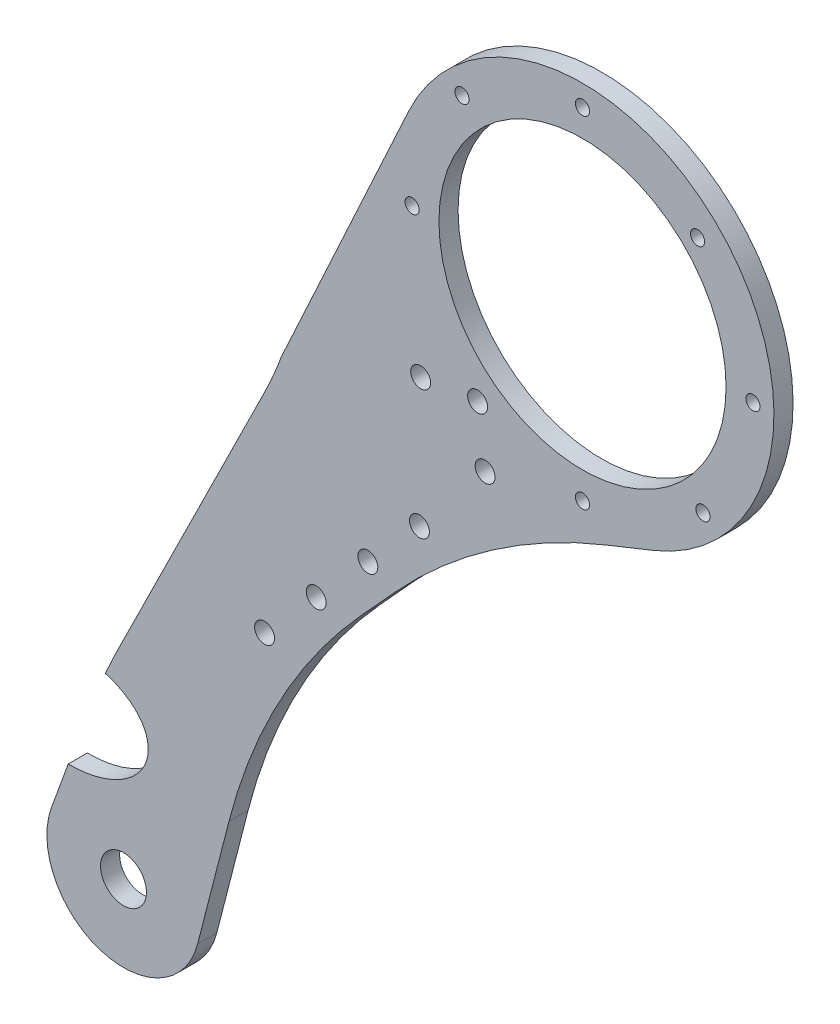
ISO-10303-21;
HEADER;
FILE_DESCRIPTION(('STEP AP214'),'2;1');
FILE_NAME('part.step','',(''),(''),'','','');
FILE_SCHEMA(('AUTOMOTIVE_DESIGN { 1 0 10303 214 1 1 1 1 }'));
ENDSEC;
DATA;
#1=APPLICATION_CONTEXT('core data for automotive mechanical design processes');
#2=APPLICATION_PROTOCOL_DEFINITION('international standard','automotive_design',2000,#1);
#3=PRODUCT_CONTEXT('',#1,'mechanical');
#4=PRODUCT('Part','Part','',(#3));
#5=PRODUCT_RELATED_PRODUCT_CATEGORY('part','',(#4));
#6=PRODUCT_DEFINITION_FORMATION('','',#4);
#7=PRODUCT_DEFINITION_CONTEXT('part definition',#1,'design');
#8=PRODUCT_DEFINITION('design','',#6,#7);
#9=PRODUCT_DEFINITION_SHAPE('','',#8);
#10=(LENGTH_UNIT() NAMED_UNIT(*) SI_UNIT(.MILLI.,.METRE.));
#11=(NAMED_UNIT(*) PLANE_ANGLE_UNIT() SI_UNIT($,.RADIAN.));
#12=(NAMED_UNIT(*) SI_UNIT($,.STERADIAN.) SOLID_ANGLE_UNIT());
#13=UNCERTAINTY_MEASURE_WITH_UNIT(LENGTH_MEASURE(1.E-05),#10,'distance_accuracy_value','');
#14=(GEOMETRIC_REPRESENTATION_CONTEXT(3) GLOBAL_UNCERTAINTY_ASSIGNED_CONTEXT((#13)) GLOBAL_UNIT_ASSIGNED_CONTEXT((#10,
#11,#12)) REPRESENTATION_CONTEXT('',''));
#15=CARTESIAN_POINT('',(0.,0.,0.));
#16=DIRECTION('',(0.,0.,1.));
#17=DIRECTION('',(1.,0.,0.));
#18=AXIS2_PLACEMENT_3D('',#15,#16,#17);
#19=CARTESIAN_POINT('',(-92.5685975077157,-82.8702446991092,5.));
#20=DIRECTION('',(0.,0.,1.));
#21=DIRECTION('',(1.,0.,0.));
#22=AXIS2_PLACEMENT_3D('',#19,#20,#21);
#23=PLANE('',#22);
#24=CARTESIAN_POINT('',(13.0554677029552,39.3964383545388,5.));
#25=DIRECTION('',(0.,0.,1.));
#26=DIRECTION('',(1.,0.,0.));
#27=AXIS2_PLACEMENT_3D('',#24,#25,#26);
#28=CIRCLE('',#27,2.6);
#29=CARTESIAN_POINT('',(15.6554677029552,39.3964383545388,5.));
#30=VERTEX_POINT('',#29);
#31=EDGE_CURVE('E163',#30,#30,#28,.T.);
#32=ORIENTED_EDGE('',*,*,#31,.F.);
#33=EDGE_LOOP('',(#32));
#34=FACE_BOUND('',#33,.T.);
#35=CARTESIAN_POINT('',(-2.12692773331795,3.57822311802661,5.));
#36=DIRECTION('',(0.,0.,1.));
#37=DIRECTION('',(1.,0.,0.));
#38=AXIS2_PLACEMENT_3D('',#35,#36,#37);
#39=CIRCLE('',#38,2.6);
#40=CARTESIAN_POINT('',(0.473072266682053,3.57822311802661,5.));
#41=VERTEX_POINT('',#40);
#42=EDGE_CURVE('E170',#41,#41,#39,.T.);
#43=ORIENTED_EDGE('',*,*,#42,.F.);
#44=EDGE_LOOP('',(#43));
#45=FACE_BOUND('',#44,.T.);
#46=CARTESIAN_POINT('',(-29.0960098710009,-25.9627418061412,5.));
#47=DIRECTION('',(0.,0.,1.));
#48=DIRECTION('',(1.,0.,0.));
#49=AXIS2_PLACEMENT_3D('',#46,#47,#48);
#50=CIRCLE('',#49,2.6);
#51=CARTESIAN_POINT('',(-26.4960098710009,-25.9627418061412,5.));
#52=VERTEX_POINT('',#51);
#53=EDGE_CURVE('E174',#52,#52,#50,.T.);
#54=ORIENTED_EDGE('',*,*,#53,.F.);
#55=EDGE_LOOP('',(#54));
#56=FACE_BOUND('',#55,.T.);
#57=CARTESIAN_POINT('',(-15.6114688021594,-11.1922593440573,5.));
#58=DIRECTION('',(0.,0.,1.));
#59=DIRECTION('',(1.,0.,0.));
#60=AXIS2_PLACEMENT_3D('',#57,#58,#59);
#61=CIRCLE('',#60,2.6);
#62=CARTESIAN_POINT('',(-13.0114688021594,-11.1922593440573,5.));
#63=VERTEX_POINT('',#62);
#64=EDGE_CURVE('E177',#63,#63,#61,.T.);
#65=ORIENTED_EDGE('',*,*,#64,.F.);
#66=EDGE_LOOP('',(#65));
#67=FACE_BOUND('',#66,.T.);
#68=CARTESIAN_POINT('',(-42.5805509398424,-40.7332242682251,5.));
#69=DIRECTION('',(0.,0.,1.));
#70=DIRECTION('',(1.,0.,0.));
#71=AXIS2_PLACEMENT_3D('',#68,#69,#70);
#72=CIRCLE('',#71,2.6);
#73=CARTESIAN_POINT('',(-39.9805509398424,-40.7332242682251,5.));
#74=VERTEX_POINT('',#73);
#75=EDGE_CURVE('E180',#74,#74,#72,.T.);
#76=ORIENTED_EDGE('',*,*,#75,.F.);
#77=EDGE_LOOP('',(#76));
#78=FACE_BOUND('',#77,.T.);
#79=CARTESIAN_POINT('',(40.4497320083475,75.0973386676444,5.));
#80=DIRECTION('',(0.,0.,1.));
#81=DIRECTION('',(1.,0.,0.));
#82=AXIS2_PLACEMENT_3D('',#79,#80,#81);
#83=CIRCLE('',#82,37.5);
#84=CARTESIAN_POINT('',(77.9497320083475,75.0973386676444,5.));
#85=VERTEX_POINT('',#84);
#86=EDGE_CURVE('E183',#85,#85,#83,.T.);
#87=ORIENTED_EDGE('',*,*,#86,.F.);
#88=EDGE_LOOP('',(#87));
#89=FACE_BOUND('',#88,.T.);
#90=CARTESIAN_POINT('',(70.5017702087758,105.149376868073,5.));
#91=DIRECTION('',(0.,0.,1.));
#92=DIRECTION('',(1.,0.,0.));
#93=AXIS2_PLACEMENT_3D('',#90,#91,#92);
#94=CIRCLE('',#93,1.85000000000002);
#95=CARTESIAN_POINT('',(72.3517702087758,105.149376868073,5.));
#96=VERTEX_POINT('',#95);
#97=EDGE_CURVE('E192',#96,#96,#94,.T.);
#98=ORIENTED_EDGE('',*,*,#97,.F.);
#99=EDGE_LOOP('',(#98));
#100=FACE_BOUND('',#99,.T.);
#101=CARTESIAN_POINT('',(-1.81620521765199,37.438545471238,5.));
#102=DIRECTION('',(0.,0.,1.));
#103=DIRECTION('',(1.,0.,0.));
#104=AXIS2_PLACEMENT_3D('',#101,#102,#103);
#105=CIRCLE('',#104,2.6);
#106=CARTESIAN_POINT('',(0.783794782348011,37.438545471238,5.));
#107=VERTEX_POINT('',#106);
#108=EDGE_CURVE('E200',#107,#107,#105,.T.);
#109=ORIENTED_EDGE('',*,*,#108,.F.);
#110=EDGE_LOOP('',(#109));
#111=FACE_BOUND('',#110,.T.);
#112=CARTESIAN_POINT('',(15.013360586256,24.5247654339316,5.));
#113=DIRECTION('',(0.,0.,1.));
#114=DIRECTION('',(1.,0.,0.));
#115=AXIS2_PLACEMENT_3D('',#112,#113,#114);
#116=CIRCLE('',#115,2.6);
#117=CARTESIAN_POINT('',(17.613360586256,24.5247654339316,5.));
#118=VERTEX_POINT('',#117);
#119=EDGE_CURVE('E206',#118,#118,#116,.T.);
#120=ORIENTED_EDGE('',*,*,#119,.F.);
#121=EDGE_LOOP('',(#120));
#122=FACE_BOUND('',#121,.T.);
#123=CARTESIAN_POINT('',(40.4497320083475,119.597338667644,5.));
#124=DIRECTION('',(0.,0.,1.));
#125=DIRECTION('',(1.,0.,0.));
#126=AXIS2_PLACEMENT_3D('',#123,#124,#125);
#127=CIRCLE('',#126,1.85);
#128=CARTESIAN_POINT('',(42.2997320083475,119.597338667644,5.));
#129=VERTEX_POINT('',#128);
#130=EDGE_CURVE('E209',#129,#129,#127,.T.);
#131=ORIENTED_EDGE('',*,*,#130,.F.);
#132=EDGE_LOOP('',(#131));
#133=FACE_BOUND('',#132,.T.);
#134=CARTESIAN_POINT('',(40.4497320083475,30.5973386676444,5.));
#135=DIRECTION('',(0.,0.,1.));
#136=DIRECTION('',(1.,0.,0.));
#137=AXIS2_PLACEMENT_3D('',#134,#135,#136);
#138=CIRCLE('',#137,1.85);
#139=CARTESIAN_POINT('',(42.2997320083475,30.5973386676444,5.));
#140=VERTEX_POINT('',#139);
#141=EDGE_CURVE('E221',#140,#140,#138,.T.);
#142=ORIENTED_EDGE('',*,*,#141,.F.);
#143=EDGE_LOOP('',(#142));
#144=FACE_BOUND('',#143,.T.);
#145=CARTESIAN_POINT('',(71.9159837711489,43.6310869048431,5.));
#146=DIRECTION('',(0.,0.,1.));
#147=DIRECTION('',(1.,0.,0.));
#148=AXIS2_PLACEMENT_3D('',#145,#146,#147);
#149=CIRCLE('',#148,1.84999999999999);
#150=CARTESIAN_POINT('',(73.7659837711489,43.6310869048431,5.));
#151=VERTEX_POINT('',#150);
#152=EDGE_CURVE('E233',#151,#151,#149,.T.);
#153=ORIENTED_EDGE('',*,*,#152,.F.);
#154=EDGE_LOOP('',(#153));
#155=FACE_BOUND('',#154,.T.);
#156=CARTESIAN_POINT('',(84.9497320083475,75.0973386676444,5.));
#157=DIRECTION('',(0.,0.,1.));
#158=DIRECTION('',(1.,0.,0.));
#159=AXIS2_PLACEMENT_3D('',#156,#157,#158);
#160=CIRCLE('',#159,1.85);
#161=CARTESIAN_POINT('',(86.7997320083475,75.0973386676444,5.));
#162=VERTEX_POINT('',#161);
#163=EDGE_CURVE('E245',#162,#162,#160,.T.);
#164=ORIENTED_EDGE('',*,*,#163,.F.);
#165=EDGE_LOOP('',(#164));
#166=FACE_BOUND('',#165,.T.);
#167=CARTESIAN_POINT('',(-4.05026799165248,75.0973386676444,5.));
#168=DIRECTION('',(0.,0.,1.));
#169=DIRECTION('',(1.,0.,0.));
#170=AXIS2_PLACEMENT_3D('',#167,#168,#169);
#171=CIRCLE('',#170,1.85);
#172=CARTESIAN_POINT('',(-2.20026799165248,75.0973386676444,5.));
#173=VERTEX_POINT('',#172);
#174=EDGE_CURVE('E239',#173,#173,#171,.T.);
#175=ORIENTED_EDGE('',*,*,#174,.F.);
#176=EDGE_LOOP('',(#175));
#177=FACE_BOUND('',#176,.T.);
#178=CARTESIAN_POINT('',(-79.4291349249004,-114.893219250955,5.));
#179=DIRECTION('',(0.,0.,1.));
#180=DIRECTION('',(1.,0.,0.));
#181=AXIS2_PLACEMENT_3D('',#178,#179,#180);
#182=CIRCLE('',#181,6.00000000000002);
#183=CARTESIAN_POINT('',(-73.4291349249004,-114.893219250955,5.));
#184=VERTEX_POINT('',#183);
#185=EDGE_CURVE('E227',#184,#184,#182,.T.);
#186=ORIENTED_EDGE('',*,*,#185,.F.);
#187=EDGE_LOOP('',(#186));
#188=FACE_BOUND('',#187,.T.);
#189=CARTESIAN_POINT('',(8.98348024554615,106.563590430446,5.));
#190=DIRECTION('',(0.,0.,1.));
#191=DIRECTION('',(1.,0.,0.));
#192=AXIS2_PLACEMENT_3D('',#189,#190,#191);
#193=CIRCLE('',#192,1.85);
#194=CARTESIAN_POINT('',(10.8334802455462,106.563590430446,5.));
#195=VERTEX_POINT('',#194);
#196=EDGE_CURVE('E215',#195,#195,#193,.T.);
#197=ORIENTED_EDGE('',*,*,#196,.F.);
#198=EDGE_LOOP('',(#197));
#199=FACE_BOUND('',#198,.T.);
#200=CARTESIAN_POINT('',(-79.4291349249004,-114.893219250955,5.));
#201=DIRECTION('',(0.,0.,1.));
#202=DIRECTION('',(1.,0.,0.));
#203=AXIS2_PLACEMENT_3D('',#200,#201,#202);
#204=CIRCLE('',#203,20.0000000000002);
#205=CARTESIAN_POINT('',(-98.2229873406187,-108.052816384441,5.));
#206=VERTEX_POINT('',#205);
#207=CARTESIAN_POINT('',(-60.0584967359329,-119.871007530112,5.));
#208=VERTEX_POINT('',#207);
#209=EDGE_CURVE('E338',#206,#208,#204,.T.);
#210=ORIENTED_EDGE('',*,*,#209,.T.);
#211=DIRECTION('',(-0.248889413957879,-0.968531909448369,0.));
#212=VECTOR('',#211,1.);
#213=CARTESIAN_POINT('',(-27.4423305383315,7.05201914226437,5.));
#214=LINE('',#213,#212);
#215=CARTESIAN_POINT('',(-51.8827092000331,-88.055628211773,5.));
#216=VERTEX_POINT('',#215);
#217=EDGE_CURVE('E160',#216,#208,#214,.T.);
#218=ORIENTED_EDGE('',*,*,#217,.F.);
#219=CARTESIAN_POINT('',(93.3970772172222,-125.389040305455,5.));
#220=DIRECTION('',(0.,0.,1.));
#221=DIRECTION('',(1.,0.,0.));
#222=AXIS2_PLACEMENT_3D('',#219,#220,#221);
#223=CIRCLE('',#222,150.);
#224=CARTESIAN_POINT('',(-17.381541248407,-24.2549822891438,5.));
#225=VERTEX_POINT('',#224);
#226=EDGE_CURVE('E395',#216,#225,#223,.F.);
#227=ORIENTED_EDGE('',*,*,#226,.T.);
#228=DIRECTION('',(0.674227053442073,0.738524123104195,0.));
#229=VECTOR('',#228,1.);
#230=CARTESIAN_POINT('',(2.59715133783699,-2.37103926476065,5.));
#231=LINE('',#230,#229);
#232=CARTESIAN_POINT('',(-8.39694682767989,-14.4135799275218,5.));
#233=VERTEX_POINT('',#232);
#234=EDGE_CURVE('E144',#225,#233,#231,.T.);
#235=ORIENTED_EDGE('',*,*,#234,.T.);
#236=CARTESIAN_POINT('',(102.381671637949,-115.547637943833,5.));
#237=DIRECTION('',(0.,0.,1.));
#238=DIRECTION('',(1.,0.,0.));
#239=AXIS2_PLACEMENT_3D('',#236,#237,#238);
#240=CIRCLE('',#239,150.);
#241=CARTESIAN_POINT('',(46.5652207080824,23.680677443497,5.));
#242=VERTEX_POINT('',#241);
#243=EDGE_CURVE('E55',#233,#242,#240,.F.);
#244=ORIENTED_EDGE('',*,*,#243,.T.);
#245=DIRECTION('',(0.928188769248865,0.372109672865779,0.));
#246=VECTOR('',#245,1.);
#247=CARTESIAN_POINT('',(-1.73134065067284,4.31864868043409,5.));
#248=LINE('',#247,#246);
#249=CARTESIAN_POINT('',(59.0552156516365,28.6879002052012,5.));
#250=VERTEX_POINT('',#249);
#251=EDGE_CURVE('E138',#242,#250,#248,.T.);
#252=ORIENTED_EDGE('',*,*,#251,.T.);
#253=CARTESIAN_POINT('',(40.4497320083475,75.0973386676444,5.));
#254=DIRECTION('',(0.,0.,1.));
#255=DIRECTION('',(1.,0.,0.));
#256=AXIS2_PLACEMENT_3D('',#253,#254,#255);
#257=CIRCLE('',#256,50.);
#258=CARTESIAN_POINT('',(-4.96294837660688,96.0183439076892,5.));
#259=VERTEX_POINT('',#258);
#260=EDGE_CURVE('E142',#250,#259,#257,.T.);
#261=ORIENTED_EDGE('',*,*,#260,.T.);
#262=DIRECTION('',(0.418420104800895,0.908253607699088,0.));
#263=VECTOR('',#262,1.);
#264=CARTESIAN_POINT('',(-40.5840602403773,18.6965255024349,5.));
#265=LINE('',#264,#263);
#266=CARTESIAN_POINT('',(-38.1758639015197,23.9239344813986,5.));
#267=VERTEX_POINT('',#266);
#268=EDGE_CURVE('E153',#267,#259,#265,.T.);
#269=ORIENTED_EDGE('',*,*,#268,.F.);
#270=CARTESIAN_POINT('',(-132.14512598011,58.125948813966,5.));
#271=DIRECTION('',(0.,0.,-1.));
#272=DIRECTION('',(1.,0.,0.));
#273=AXIS2_PLACEMENT_3D('',#270,#271,#272);
#274=CIRCLE('',#273,100.);
#275=CARTESIAN_POINT('',(-42.5310244349342,13.749008808476,5.));
#276=VERTEX_POINT('',#275);
#277=EDGE_CURVE('E251',#267,#276,#274,.T.);
#278=ORIENTED_EDGE('',*,*,#277,.T.);
#279=DIRECTION('',(-0.4437694000549,-0.896141015451761,0.));
#280=VECTOR('',#279,1.);
#281=CARTESIAN_POINT('',(-42.5310244349342,13.749008808476,5.));
#282=LINE('',#281,#280);
#283=CARTESIAN_POINT('',(-80.4781362784233,-62.8807978809415,5.));
#284=VERTEX_POINT('',#283);
#285=EDGE_CURVE('E253',#276,#284,#282,.T.);
#286=ORIENTED_EDGE('',*,*,#285,.T.);
#287=CARTESIAN_POINT('',(98.750066811929,-151.634677891922,5.));
#288=DIRECTION('',(0.,0.,1.));
#289=DIRECTION('',(1.,0.,0.));
#290=AXIS2_PLACEMENT_3D('',#287,#288,#289);
#291=CIRCLE('',#290,200.);
#292=CARTESIAN_POINT('',(-84.151417051104,-70.7208521221517,5.));
#293=VERTEX_POINT('',#292);
#294=EDGE_CURVE('E256',#284,#293,#291,.T.);
#295=ORIENTED_EDGE('',*,*,#294,.T.);
#296=CARTESIAN_POINT('',(-92.5685975077157,-82.8702446991092,5.));
#297=DIRECTION('',(0.,0.,-1.));
#298=DIRECTION('',(0.998564288915161,0.0535664158158636,0.));
#299=AXIS2_PLACEMENT_3D('',#296,#297,#298);
#300=ELLIPSE('',#299,19.6254544070607,13.1666159932936);
#301=CARTESIAN_POINT('',(-93.8567760538922,-96.0567494655923,5.));
#302=VERTEX_POINT('',#301);
#303=EDGE_CURVE('E258',#293,#302,#300,.T.);
#304=ORIENTED_EDGE('',*,*,#303,.T.);
#305=DIRECTION('',(-0.342020143325669,-0.939692620785908,0.));
#306=VECTOR('',#305,1.);
#307=CARTESIAN_POINT('',(-93.8567760538922,-96.0567494655923,5.));
#308=LINE('',#307,#306);
#309=EDGE_CURVE('E261',#302,#206,#308,.T.);
#310=ORIENTED_EDGE('',*,*,#309,.T.);
#311=EDGE_LOOP('',(#210,#218,#227,#235,#244,#252,#261,#269,#278,#286,#295,#304,#310));
#312=FACE_BOUND('',#311,.T.);
#313=ADVANCED_FACE('F47',(#34,#45,#56,#67,#78,#89,#100,#111,#122,#133,#144,#155,#166,#177,#188,
#199,#312),#23,.T.);
#314=CARTESIAN_POINT('',(-92.5685975077157,-82.8702446991092,0.));
#315=DIRECTION('',(0.,0.,1.));
#316=DIRECTION('',(1.,0.,0.));
#317=AXIS2_PLACEMENT_3D('',#314,#315,#316);
#318=PLANE('',#317);
#319=CARTESIAN_POINT('',(40.4497320083475,119.597338667644,0.));
#320=DIRECTION('',(0.,0.,1.));
#321=DIRECTION('',(1.,0.,0.));
#322=AXIS2_PLACEMENT_3D('',#319,#320,#321);
#323=CIRCLE('',#322,1.85);
#324=CARTESIAN_POINT('',(42.2997320083475,119.597338667644,0.));
#325=VERTEX_POINT('',#324);
#326=EDGE_CURVE('E199',#325,#325,#323,.T.);
#327=ORIENTED_EDGE('',*,*,#326,.T.);
#328=EDGE_LOOP('',(#327));
#329=FACE_BOUND('',#328,.T.);
#330=CARTESIAN_POINT('',(8.98348024554615,106.563590430446,0.));
#331=DIRECTION('',(0.,0.,1.));
#332=DIRECTION('',(1.,0.,0.));
#333=AXIS2_PLACEMENT_3D('',#330,#331,#332);
#334=CIRCLE('',#333,1.85);
#335=CARTESIAN_POINT('',(10.8334802455462,106.563590430446,0.));
#336=VERTEX_POINT('',#335);
#337=EDGE_CURVE('E212',#336,#336,#334,.T.);
#338=ORIENTED_EDGE('',*,*,#337,.T.);
#339=EDGE_LOOP('',(#338));
#340=FACE_BOUND('',#339,.T.);
#341=CARTESIAN_POINT('',(40.4497320083475,30.5973386676444,0.));
#342=DIRECTION('',(0.,0.,1.));
#343=DIRECTION('',(1.,0.,0.));
#344=AXIS2_PLACEMENT_3D('',#341,#342,#343);
#345=CIRCLE('',#344,1.85);
#346=CARTESIAN_POINT('',(42.2997320083475,30.5973386676444,0.));
#347=VERTEX_POINT('',#346);
#348=EDGE_CURVE('E218',#347,#347,#345,.T.);
#349=ORIENTED_EDGE('',*,*,#348,.T.);
#350=EDGE_LOOP('',(#349));
#351=FACE_BOUND('',#350,.T.);
#352=CARTESIAN_POINT('',(-79.4291349249004,-114.893219250955,0.));
#353=DIRECTION('',(0.,0.,1.));
#354=DIRECTION('',(1.,0.,0.));
#355=AXIS2_PLACEMENT_3D('',#352,#353,#354);
#356=CIRCLE('',#355,6.00000000000002);
#357=CARTESIAN_POINT('',(-73.4291349249004,-114.893219250955,0.));
#358=VERTEX_POINT('',#357);
#359=EDGE_CURVE('E224',#358,#358,#356,.T.);
#360=ORIENTED_EDGE('',*,*,#359,.T.);
#361=EDGE_LOOP('',(#360));
#362=FACE_BOUND('',#361,.T.);
#363=CARTESIAN_POINT('',(71.9159837711489,43.6310869048431,0.));
#364=DIRECTION('',(0.,0.,1.));
#365=DIRECTION('',(1.,0.,0.));
#366=AXIS2_PLACEMENT_3D('',#363,#364,#365);
#367=CIRCLE('',#366,1.84999999999999);
#368=CARTESIAN_POINT('',(73.7659837711489,43.6310869048431,0.));
#369=VERTEX_POINT('',#368);
#370=EDGE_CURVE('E230',#369,#369,#367,.T.);
#371=ORIENTED_EDGE('',*,*,#370,.T.);
#372=EDGE_LOOP('',(#371));
#373=FACE_BOUND('',#372,.T.);
#374=CARTESIAN_POINT('',(-4.05026799165248,75.0973386676444,0.));
#375=DIRECTION('',(0.,0.,1.));
#376=DIRECTION('',(1.,0.,0.));
#377=AXIS2_PLACEMENT_3D('',#374,#375,#376);
#378=CIRCLE('',#377,1.85);
#379=CARTESIAN_POINT('',(-2.20026799165248,75.0973386676444,0.));
#380=VERTEX_POINT('',#379);
#381=EDGE_CURVE('E236',#380,#380,#378,.T.);
#382=ORIENTED_EDGE('',*,*,#381,.T.);
#383=EDGE_LOOP('',(#382));
#384=FACE_BOUND('',#383,.T.);
#385=CARTESIAN_POINT('',(84.9497320083475,75.0973386676444,0.));
#386=DIRECTION('',(0.,0.,1.));
#387=DIRECTION('',(1.,0.,0.));
#388=AXIS2_PLACEMENT_3D('',#385,#386,#387);
#389=CIRCLE('',#388,1.85);
#390=CARTESIAN_POINT('',(86.7997320083475,75.0973386676444,0.));
#391=VERTEX_POINT('',#390);
#392=EDGE_CURVE('E242',#391,#391,#389,.T.);
#393=ORIENTED_EDGE('',*,*,#392,.T.);
#394=EDGE_LOOP('',(#393));
#395=FACE_BOUND('',#394,.T.);
#396=CARTESIAN_POINT('',(15.013360586256,24.5247654339316,0.));
#397=DIRECTION('',(0.,0.,1.));
#398=DIRECTION('',(1.,0.,0.));
#399=AXIS2_PLACEMENT_3D('',#396,#397,#398);
#400=CIRCLE('',#399,2.6);
#401=CARTESIAN_POINT('',(17.613360586256,24.5247654339316,0.));
#402=VERTEX_POINT('',#401);
#403=EDGE_CURVE('E203',#402,#402,#400,.T.);
#404=ORIENTED_EDGE('',*,*,#403,.T.);
#405=EDGE_LOOP('',(#404));
#406=FACE_BOUND('',#405,.T.);
#407=CARTESIAN_POINT('',(-1.81620521765199,37.438545471238,0.));
#408=DIRECTION('',(0.,0.,1.));
#409=DIRECTION('',(1.,0.,0.));
#410=AXIS2_PLACEMENT_3D('',#407,#408,#409);
#411=CIRCLE('',#410,2.6);
#412=CARTESIAN_POINT('',(0.783794782348011,37.438545471238,0.));
#413=VERTEX_POINT('',#412);
#414=EDGE_CURVE('E196',#413,#413,#411,.T.);
#415=ORIENTED_EDGE('',*,*,#414,.T.);
#416=EDGE_LOOP('',(#415));
#417=FACE_BOUND('',#416,.T.);
#418=CARTESIAN_POINT('',(70.5017702087758,105.149376868073,0.));
#419=DIRECTION('',(0.,0.,1.));
#420=DIRECTION('',(1.,0.,0.));
#421=AXIS2_PLACEMENT_3D('',#418,#419,#420);
#422=CIRCLE('',#421,1.85000000000002);
#423=CARTESIAN_POINT('',(72.3517702087758,105.149376868073,0.));
#424=VERTEX_POINT('',#423);
#425=EDGE_CURVE('E195',#424,#424,#422,.T.);
#426=ORIENTED_EDGE('',*,*,#425,.T.);
#427=EDGE_LOOP('',(#426));
#428=FACE_BOUND('',#427,.T.);
#429=CARTESIAN_POINT('',(40.4497320083475,75.0973386676444,0.));
#430=DIRECTION('',(0.,0.,1.));
#431=DIRECTION('',(1.,0.,0.));
#432=AXIS2_PLACEMENT_3D('',#429,#430,#431);
#433=CIRCLE('',#432,37.5);
#434=CARTESIAN_POINT('',(77.9497320083475,75.0973386676444,0.));
#435=VERTEX_POINT('',#434);
#436=EDGE_CURVE('E154',#435,#435,#433,.T.);
#437=ORIENTED_EDGE('',*,*,#436,.T.);
#438=EDGE_LOOP('',(#437));
#439=FACE_BOUND('',#438,.T.);
#440=CARTESIAN_POINT('',(-42.5805509398424,-40.7332242682251,0.));
#441=DIRECTION('',(0.,0.,1.));
#442=DIRECTION('',(1.,0.,0.));
#443=AXIS2_PLACEMENT_3D('',#440,#441,#442);
#444=CIRCLE('',#443,2.6);
#445=CARTESIAN_POINT('',(-39.9805509398424,-40.7332242682251,0.));
#446=VERTEX_POINT('',#445);
#447=EDGE_CURVE('E173',#446,#446,#444,.T.);
#448=ORIENTED_EDGE('',*,*,#447,.T.);
#449=EDGE_LOOP('',(#448));
#450=FACE_BOUND('',#449,.T.);
#451=CARTESIAN_POINT('',(-15.6114688021594,-11.1922593440573,0.));
#452=DIRECTION('',(0.,0.,1.));
#453=DIRECTION('',(1.,0.,0.));
#454=AXIS2_PLACEMENT_3D('',#451,#452,#453);
#455=CIRCLE('',#454,2.6);
#456=CARTESIAN_POINT('',(-13.0114688021594,-11.1922593440573,0.));
#457=VERTEX_POINT('',#456);
#458=EDGE_CURVE('E373',#457,#457,#455,.T.);
#459=ORIENTED_EDGE('',*,*,#458,.T.);
#460=EDGE_LOOP('',(#459));
#461=FACE_BOUND('',#460,.T.);
#462=CARTESIAN_POINT('',(-29.0960098710009,-25.9627418061412,0.));
#463=DIRECTION('',(0.,0.,1.));
#464=DIRECTION('',(1.,0.,0.));
#465=AXIS2_PLACEMENT_3D('',#462,#463,#464);
#466=CIRCLE('',#465,2.6);
#467=CARTESIAN_POINT('',(-26.4960098710009,-25.9627418061412,0.));
#468=VERTEX_POINT('',#467);
#469=EDGE_CURVE('E376',#468,#468,#466,.T.);
#470=ORIENTED_EDGE('',*,*,#469,.T.);
#471=EDGE_LOOP('',(#470));
#472=FACE_BOUND('',#471,.T.);
#473=CARTESIAN_POINT('',(-2.12692773331795,3.57822311802661,0.));
#474=DIRECTION('',(0.,0.,1.));
#475=DIRECTION('',(1.,0.,0.));
#476=AXIS2_PLACEMENT_3D('',#473,#474,#475);
#477=CIRCLE('',#476,2.6);
#478=CARTESIAN_POINT('',(0.473072266682053,3.57822311802661,0.));
#479=VERTEX_POINT('',#478);
#480=EDGE_CURVE('E185',#479,#479,#477,.T.);
#481=ORIENTED_EDGE('',*,*,#480,.T.);
#482=EDGE_LOOP('',(#481));
#483=FACE_BOUND('',#482,.T.);
#484=CARTESIAN_POINT('',(13.0554677029552,39.3964383545388,0.));
#485=DIRECTION('',(0.,0.,1.));
#486=DIRECTION('',(1.,0.,0.));
#487=AXIS2_PLACEMENT_3D('',#484,#485,#486);
#488=CIRCLE('',#487,2.6);
#489=CARTESIAN_POINT('',(15.6554677029552,39.3964383545388,0.));
#490=VERTEX_POINT('',#489);
#491=EDGE_CURVE('E169',#490,#490,#488,.T.);
#492=ORIENTED_EDGE('',*,*,#491,.T.);
#493=EDGE_LOOP('',(#492));
#494=FACE_BOUND('',#493,.T.);
#495=DIRECTION('',(0.674227053442073,0.738524123104195,0.));
#496=VECTOR('',#495,1.);
#497=CARTESIAN_POINT('',(-80.7467027896559,-93.6629067022912,0.));
#498=LINE('',#497,#496);
#499=CARTESIAN_POINT('',(-17.3815412484069,-24.2549822891438,0.));
#500=VERTEX_POINT('',#499);
#501=CARTESIAN_POINT('',(-8.39694682767987,-14.4135799275218,0.));
#502=VERTEX_POINT('',#501);
#503=EDGE_CURVE('E384',#500,#502,#498,.T.);
#504=ORIENTED_EDGE('',*,*,#503,.F.);
#505=CARTESIAN_POINT('',(93.3970772172222,-125.389040305455,0.));
#506=DIRECTION('',(0.,0.,1.));
#507=DIRECTION('',(1.,0.,0.));
#508=AXIS2_PLACEMENT_3D('',#505,#506,#507);
#509=CIRCLE('',#508,150.);
#510=CARTESIAN_POINT('',(-51.8827092000331,-88.0556282117729,0.));
#511=VERTEX_POINT('',#510);
#512=EDGE_CURVE('E397',#500,#511,#509,.T.);
#513=ORIENTED_EDGE('',*,*,#512,.T.);
#514=DIRECTION('',(-0.248889413957879,-0.968531909448369,0.));
#515=VECTOR('',#514,1.);
#516=CARTESIAN_POINT('',(-53.1530600584291,-92.9990901412539,0.));
#517=LINE('',#516,#515);
#518=CARTESIAN_POINT('',(-60.0584967359329,-119.871007530112,0.));
#519=VERTEX_POINT('',#518);
#520=EDGE_CURVE('E334',#511,#519,#517,.T.);
#521=ORIENTED_EDGE('',*,*,#520,.T.);
#522=CARTESIAN_POINT('',(-79.4291349249004,-114.893219250955,0.));
#523=DIRECTION('',(0.,0.,1.));
#524=DIRECTION('',(1.,0.,0.));
#525=AXIS2_PLACEMENT_3D('',#522,#523,#524);
#526=CIRCLE('',#525,20.0000000000002);
#527=CARTESIAN_POINT('',(-98.2229873406187,-108.052816384441,0.));
#528=VERTEX_POINT('',#527);
#529=EDGE_CURVE('E254',#528,#519,#526,.T.);
#530=ORIENTED_EDGE('',*,*,#529,.F.);
#531=DIRECTION('',(-0.342020143325669,-0.939692620785908,0.));
#532=VECTOR('',#531,1.);
#533=CARTESIAN_POINT('',(-93.8567760538922,-96.0567494655923,0.));
#534=LINE('',#533,#532);
#535=CARTESIAN_POINT('',(-93.8567760538922,-96.0567494655923,0.));
#536=VERTEX_POINT('',#535);
#537=EDGE_CURVE('E328',#536,#528,#534,.T.);
#538=ORIENTED_EDGE('',*,*,#537,.F.);
#539=CARTESIAN_POINT('',(-92.5685975077157,-82.8702446991092,0.));
#540=DIRECTION('',(0.,0.,-1.));
#541=DIRECTION('',(0.998564288915161,0.0535664158158636,0.));
#542=AXIS2_PLACEMENT_3D('',#539,#540,#541);
#543=ELLIPSE('',#542,19.6254544070607,13.1666159932936);
#544=CARTESIAN_POINT('',(-84.151417051104,-70.7208521221517,0.));
#545=VERTEX_POINT('',#544);
#546=EDGE_CURVE('E348',#545,#536,#543,.T.);
#547=ORIENTED_EDGE('',*,*,#546,.F.);
#548=CARTESIAN_POINT('',(98.750066811929,-151.634677891922,0.));
#549=DIRECTION('',(0.,0.,1.));
#550=DIRECTION('',(1.,0.,0.));
#551=AXIS2_PLACEMENT_3D('',#548,#549,#550);
#552=CIRCLE('',#551,200.);
#553=CARTESIAN_POINT('',(-80.4781362784233,-62.8807978809415,0.));
#554=VERTEX_POINT('',#553);
#555=EDGE_CURVE('E346',#554,#545,#552,.T.);
#556=ORIENTED_EDGE('',*,*,#555,.F.);
#557=DIRECTION('',(-0.4437694000549,-0.896141015451761,0.));
#558=VECTOR('',#557,1.);
#559=CARTESIAN_POINT('',(-42.5310244349342,13.749008808476,0.));
#560=LINE('',#559,#558);
#561=CARTESIAN_POINT('',(-42.5310244349342,13.749008808476,0.));
#562=VERTEX_POINT('',#561);
#563=EDGE_CURVE('E344',#562,#554,#560,.T.);
#564=ORIENTED_EDGE('',*,*,#563,.F.);
#565=CARTESIAN_POINT('',(-132.14512598011,58.125948813966,0.));
#566=DIRECTION('',(0.,0.,-1.));
#567=DIRECTION('',(1.,0.,0.));
#568=AXIS2_PLACEMENT_3D('',#565,#566,#567);
#569=CIRCLE('',#568,100.);
#570=CARTESIAN_POINT('',(-38.1758639015197,23.9239344813986,0.));
#571=VERTEX_POINT('',#570);
#572=EDGE_CURVE('E248',#571,#562,#569,.T.);
#573=ORIENTED_EDGE('',*,*,#572,.F.);
#574=DIRECTION('',(0.418420104800895,0.908253607699088,0.));
#575=VECTOR('',#574,1.);
#576=CARTESIAN_POINT('',(-88.2838521808065,-84.8441686929509,0.));
#577=LINE('',#576,#575);
#578=CARTESIAN_POINT('',(-4.96294837660688,96.0183439076892,0.));
#579=VERTEX_POINT('',#578);
#580=EDGE_CURVE('E189',#571,#579,#577,.T.);
#581=ORIENTED_EDGE('',*,*,#580,.T.);
#582=CARTESIAN_POINT('',(40.4497320083475,75.0973386676444,0.));
#583=DIRECTION('',(0.,0.,1.));
#584=DIRECTION('',(1.,0.,0.));
#585=AXIS2_PLACEMENT_3D('',#582,#583,#584);
#586=CIRCLE('',#585,50.);
#587=CARTESIAN_POINT('',(59.0552156516365,28.6879002052012,0.));
#588=VERTEX_POINT('',#587);
#589=EDGE_CURVE('E365',#588,#579,#586,.T.);
#590=ORIENTED_EDGE('',*,*,#589,.F.);
#591=DIRECTION('',(0.928188769248865,0.372109672865779,0.));
#592=VECTOR('',#591,1.);
#593=CARTESIAN_POINT('',(-110.104760637619,-39.1281147309813,0.));
#594=LINE('',#593,#592);
#595=CARTESIAN_POINT('',(46.5652207080824,23.680677443497,0.));
#596=VERTEX_POINT('',#595);
#597=EDGE_CURVE('E157',#596,#588,#594,.T.);
#598=ORIENTED_EDGE('',*,*,#597,.F.);
#599=CARTESIAN_POINT('',(102.381671637949,-115.547637943833,0.));
#600=DIRECTION('',(0.,0.,1.));
#601=DIRECTION('',(1.,0.,0.));
#602=AXIS2_PLACEMENT_3D('',#599,#600,#601);
#603=CIRCLE('',#602,150.);
#604=EDGE_CURVE('E11',#596,#502,#603,.T.);
#605=ORIENTED_EDGE('',*,*,#604,.T.);
#606=EDGE_LOOP('',(#504,#513,#521,#530,#538,#547,#556,#564,#573,#581,#590,#598,#605));
#607=FACE_BOUND('',#606,.T.);
#608=ADVANCED_FACE('F281',(#329,#340,#351,#362,#373,#384,#395,#406,#417,#428,#439,#450,#461,
#472,#483,#494,#607),#318,.F.);
#609=CARTESIAN_POINT('',(-132.14512598011,58.125948813966,5.));
#610=DIRECTION('',(0.,0.,-1.));
#611=DIRECTION('',(-1.,0.,0.));
#612=AXIS2_PLACEMENT_3D('',#609,#610,#611);
#613=CYLINDRICAL_SURFACE('',#612,100.);
#614=ORIENTED_EDGE('',*,*,#572,.T.);
#615=DIRECTION('',(0.,0.,-1.));
#616=VECTOR('',#615,1.);
#617=CARTESIAN_POINT('',(-42.5310244349342,13.749008808476,5.));
#618=LINE('',#617,#616);
#619=EDGE_CURVE('E359',#276,#562,#618,.T.);
#620=ORIENTED_EDGE('',*,*,#619,.F.);
#621=ORIENTED_EDGE('',*,*,#277,.F.);
#622=DIRECTION('',(0.,0.,-1.));
#623=VECTOR('',#622,1.);
#624=CARTESIAN_POINT('',(-38.1758639015197,23.9239344813986,5.));
#625=LINE('',#624,#623);
#626=EDGE_CURVE('E362',#267,#571,#625,.T.);
#627=ORIENTED_EDGE('',*,*,#626,.T.);
#628=EDGE_LOOP('',(#614,#620,#621,#627));
#629=FACE_BOUND('',#628,.T.);
#630=ADVANCED_FACE('F278',(#629),#613,.F.);
#631=CARTESIAN_POINT('',(-42.5310244349342,13.749008808476,5.));
#632=DIRECTION('',(0.896141015451761,-0.4437694000549,0.));
#633=DIRECTION('',(0.4437694000549,0.896141015451761,0.));
#634=AXIS2_PLACEMENT_3D('',#631,#632,#633);
#635=PLANE('',#634);
#636=ORIENTED_EDGE('',*,*,#563,.T.);
#637=DIRECTION('',(0.,0.,-1.));
#638=VECTOR('',#637,1.);
#639=CARTESIAN_POINT('',(-80.4781362784233,-62.8807978809415,5.));
#640=LINE('',#639,#638);
#641=EDGE_CURVE('E356',#284,#554,#640,.T.);
#642=ORIENTED_EDGE('',*,*,#641,.F.);
#643=ORIENTED_EDGE('',*,*,#285,.F.);
#644=ORIENTED_EDGE('',*,*,#619,.T.);
#645=EDGE_LOOP('',(#636,#642,#643,#644));
#646=FACE_BOUND('',#645,.T.);
#647=ADVANCED_FACE('F274',(#646),#635,.F.);
#648=CARTESIAN_POINT('',(98.750066811929,-151.634677891922,5.));
#649=DIRECTION('',(0.,0.,-1.));
#650=DIRECTION('',(-1.,0.,0.));
#651=AXIS2_PLACEMENT_3D('',#648,#649,#650);
#652=CYLINDRICAL_SURFACE('',#651,200.);
#653=ORIENTED_EDGE('',*,*,#555,.T.);
#654=DIRECTION('',(0.,0.,-1.));
#655=VECTOR('',#654,1.);
#656=CARTESIAN_POINT('',(-84.151417051104,-70.7208521221517,5.));
#657=LINE('',#656,#655);
#658=EDGE_CURVE('E353',#293,#545,#657,.T.);
#659=ORIENTED_EDGE('',*,*,#658,.F.);
#660=ORIENTED_EDGE('',*,*,#294,.F.);
#661=ORIENTED_EDGE('',*,*,#641,.T.);
#662=EDGE_LOOP('',(#653,#659,#660,#661));
#663=FACE_BOUND('',#662,.T.);
#664=ADVANCED_FACE('F269',(#663),#652,.T.);
#665=DIRECTION('',(0.,0.,-1.));
#666=VECTOR('',#665,1.);
#667=SURFACE_OF_LINEAR_EXTRUSION('',#300,#666);
#668=ORIENTED_EDGE('',*,*,#546,.T.);
#669=DIRECTION('',(0.,0.,-1.));
#670=VECTOR('',#669,1.);
#671=CARTESIAN_POINT('',(-93.8567760538922,-96.0567494655923,5.));
#672=LINE('',#671,#670);
#673=EDGE_CURVE('E340',#302,#536,#672,.T.);
#674=ORIENTED_EDGE('',*,*,#673,.F.);
#675=ORIENTED_EDGE('',*,*,#303,.F.);
#676=ORIENTED_EDGE('',*,*,#658,.T.);
#677=EDGE_LOOP('',(#668,#674,#675,#676));
#678=FACE_BOUND('',#677,.T.);
#679=ADVANCED_FACE('F264',(#678),#667,.F.);
#680=CARTESIAN_POINT('',(-93.8567760538922,-96.0567494655923,5.));
#681=DIRECTION('',(0.939692620785908,-0.342020143325669,0.));
#682=DIRECTION('',(0.342020143325669,0.939692620785908,0.));
#683=AXIS2_PLACEMENT_3D('',#680,#681,#682);
#684=PLANE('',#683);
#685=ORIENTED_EDGE('',*,*,#537,.T.);
#686=DIRECTION('',(0.,0.,-1.));
#687=VECTOR('',#686,1.);
#688=CARTESIAN_POINT('',(-98.2229873406187,-108.052816384441,5.));
#689=LINE('',#688,#687);
#690=EDGE_CURVE('E325',#206,#528,#689,.T.);
#691=ORIENTED_EDGE('',*,*,#690,.F.);
#692=ORIENTED_EDGE('',*,*,#309,.F.);
#693=ORIENTED_EDGE('',*,*,#673,.T.);
#694=EDGE_LOOP('',(#685,#691,#692,#693));
#695=FACE_BOUND('',#694,.T.);
#696=ADVANCED_FACE('F268',(#695),#684,.F.);
#697=CARTESIAN_POINT('',(-79.4291349249004,-114.893219250955,5.));
#698=DIRECTION('',(0.,0.,-1.));
#699=DIRECTION('',(-1.,0.,0.));
#700=AXIS2_PLACEMENT_3D('',#697,#698,#699);
#701=CYLINDRICAL_SURFACE('',#700,20.0000000000002);
#702=ORIENTED_EDGE('',*,*,#529,.T.);
#703=DIRECTION('',(0.,0.,1.));
#704=VECTOR('',#703,1.);
#705=CARTESIAN_POINT('',(-60.0584967359329,-119.871007530112,-5.));
#706=LINE('',#705,#704);
#707=EDGE_CURVE('E159',#519,#208,#706,.T.);
#708=ORIENTED_EDGE('',*,*,#707,.T.);
#709=ORIENTED_EDGE('',*,*,#209,.F.);
#710=ORIENTED_EDGE('',*,*,#690,.T.);
#711=EDGE_LOOP('',(#702,#708,#709,#710));
#712=FACE_BOUND('',#711,.T.);
#713=ADVANCED_FACE('F308',(#712),#701,.T.);
#714=CARTESIAN_POINT('',(84.9497320083475,75.0973386676444,5.));
#715=DIRECTION('',(0.,0.,-1.));
#716=DIRECTION('',(-1.,0.,0.));
#717=AXIS2_PLACEMENT_3D('',#714,#715,#716);
#718=CYLINDRICAL_SURFACE('',#717,1.85);
#719=ORIENTED_EDGE('',*,*,#163,.T.);
#720=EDGE_LOOP('',(#719));
#721=FACE_BOUND('',#720,.T.);
#722=ORIENTED_EDGE('',*,*,#392,.F.);
#723=EDGE_LOOP('',(#722));
#724=FACE_BOUND('',#723,.T.);
#725=ADVANCED_FACE('F306',(#721,#724),#718,.F.);
#726=CARTESIAN_POINT('',(-4.05026799165248,75.0973386676444,5.));
#727=DIRECTION('',(0.,0.,-1.));
#728=DIRECTION('',(-1.,0.,0.));
#729=AXIS2_PLACEMENT_3D('',#726,#727,#728);
#730=CYLINDRICAL_SURFACE('',#729,1.85);
#731=ORIENTED_EDGE('',*,*,#174,.T.);
#732=EDGE_LOOP('',(#731));
#733=FACE_BOUND('',#732,.T.);
#734=ORIENTED_EDGE('',*,*,#381,.F.);
#735=EDGE_LOOP('',(#734));
#736=FACE_BOUND('',#735,.T.);
#737=ADVANCED_FACE('F315',(#733,#736),#730,.F.);
#738=CARTESIAN_POINT('',(71.9159837711489,43.6310869048431,5.));
#739=DIRECTION('',(0.,0.,-1.));
#740=DIRECTION('',(-1.,0.,0.));
#741=AXIS2_PLACEMENT_3D('',#738,#739,#740);
#742=CYLINDRICAL_SURFACE('',#741,1.84999999999999);
#743=ORIENTED_EDGE('',*,*,#152,.T.);
#744=EDGE_LOOP('',(#743));
#745=FACE_BOUND('',#744,.T.);
#746=ORIENTED_EDGE('',*,*,#370,.F.);
#747=EDGE_LOOP('',(#746));
#748=FACE_BOUND('',#747,.T.);
#749=ADVANCED_FACE('F458',(#745,#748),#742,.F.);
#750=CARTESIAN_POINT('',(-79.4291349249004,-114.893219250955,5.));
#751=DIRECTION('',(0.,0.,-1.));
#752=DIRECTION('',(-1.,0.,0.));
#753=AXIS2_PLACEMENT_3D('',#750,#751,#752);
#754=CYLINDRICAL_SURFACE('',#753,6.00000000000002);
#755=ORIENTED_EDGE('',*,*,#185,.T.);
#756=EDGE_LOOP('',(#755));
#757=FACE_BOUND('',#756,.T.);
#758=ORIENTED_EDGE('',*,*,#359,.F.);
#759=EDGE_LOOP('',(#758));
#760=FACE_BOUND('',#759,.T.);
#761=ADVANCED_FACE('F454',(#757,#760),#754,.F.);
#762=CARTESIAN_POINT('',(40.4497320083475,30.5973386676444,5.));
#763=DIRECTION('',(0.,0.,-1.));
#764=DIRECTION('',(-1.,0.,0.));
#765=AXIS2_PLACEMENT_3D('',#762,#763,#764);
#766=CYLINDRICAL_SURFACE('',#765,1.85);
#767=ORIENTED_EDGE('',*,*,#141,.T.);
#768=EDGE_LOOP('',(#767));
#769=FACE_BOUND('',#768,.T.);
#770=ORIENTED_EDGE('',*,*,#348,.F.);
#771=EDGE_LOOP('',(#770));
#772=FACE_BOUND('',#771,.T.);
#773=ADVANCED_FACE('F450',(#769,#772),#766,.F.);
#774=CARTESIAN_POINT('',(8.98348024554615,106.563590430446,5.));
#775=DIRECTION('',(0.,0.,-1.));
#776=DIRECTION('',(-1.,0.,0.));
#777=AXIS2_PLACEMENT_3D('',#774,#775,#776);
#778=CYLINDRICAL_SURFACE('',#777,1.85);
#779=ORIENTED_EDGE('',*,*,#196,.T.);
#780=EDGE_LOOP('',(#779));
#781=FACE_BOUND('',#780,.T.);
#782=ORIENTED_EDGE('',*,*,#337,.F.);
#783=EDGE_LOOP('',(#782));
#784=FACE_BOUND('',#783,.T.);
#785=ADVANCED_FACE('F446',(#781,#784),#778,.F.);
#786=CARTESIAN_POINT('',(40.4497320083475,119.597338667644,5.));
#787=DIRECTION('',(0.,0.,-1.));
#788=DIRECTION('',(-1.,0.,0.));
#789=AXIS2_PLACEMENT_3D('',#786,#787,#788);
#790=CYLINDRICAL_SURFACE('',#789,1.85);
#791=ORIENTED_EDGE('',*,*,#130,.T.);
#792=EDGE_LOOP('',(#791));
#793=FACE_BOUND('',#792,.T.);
#794=ORIENTED_EDGE('',*,*,#326,.F.);
#795=EDGE_LOOP('',(#794));
#796=FACE_BOUND('',#795,.T.);
#797=ADVANCED_FACE('F442',(#793,#796),#790,.F.);
#798=CARTESIAN_POINT('',(15.013360586256,24.5247654339316,0.));
#799=DIRECTION('',(0.,0.,1.));
#800=DIRECTION('',(1.,0.,0.));
#801=AXIS2_PLACEMENT_3D('',#798,#799,#800);
#802=CYLINDRICAL_SURFACE('',#801,2.6);
#803=ORIENTED_EDGE('',*,*,#403,.F.);
#804=EDGE_LOOP('',(#803));
#805=FACE_BOUND('',#804,.T.);
#806=ORIENTED_EDGE('',*,*,#119,.T.);
#807=EDGE_LOOP('',(#806));
#808=FACE_BOUND('',#807,.T.);
#809=ADVANCED_FACE('F438',(#805,#808),#802,.F.);
#810=CARTESIAN_POINT('',(-1.81620521765199,37.438545471238,0.));
#811=DIRECTION('',(0.,0.,1.));
#812=DIRECTION('',(1.,0.,0.));
#813=AXIS2_PLACEMENT_3D('',#810,#811,#812);
#814=CYLINDRICAL_SURFACE('',#813,2.6);
#815=ORIENTED_EDGE('',*,*,#414,.F.);
#816=EDGE_LOOP('',(#815));
#817=FACE_BOUND('',#816,.T.);
#818=ORIENTED_EDGE('',*,*,#108,.T.);
#819=EDGE_LOOP('',(#818));
#820=FACE_BOUND('',#819,.T.);
#821=ADVANCED_FACE('F434',(#817,#820),#814,.F.);
#822=CARTESIAN_POINT('',(70.5017702087758,105.149376868073,-5.));
#823=DIRECTION('',(0.,0.,1.));
#824=DIRECTION('',(1.,0.,0.));
#825=AXIS2_PLACEMENT_3D('',#822,#823,#824);
#826=CYLINDRICAL_SURFACE('',#825,1.85000000000002);
#827=ORIENTED_EDGE('',*,*,#97,.T.);
#828=EDGE_LOOP('',(#827));
#829=FACE_BOUND('',#828,.T.);
#830=ORIENTED_EDGE('',*,*,#425,.F.);
#831=EDGE_LOOP('',(#830));
#832=FACE_BOUND('',#831,.T.);
#833=ADVANCED_FACE('F429',(#829,#832),#826,.F.);
#834=CARTESIAN_POINT('',(40.4497320083475,75.0973386676444,-5.));
#835=DIRECTION('',(0.,0.,1.));
#836=DIRECTION('',(1.,0.,0.));
#837=AXIS2_PLACEMENT_3D('',#834,#835,#836);
#838=CYLINDRICAL_SURFACE('',#837,50.);
#839=ORIENTED_EDGE('',*,*,#589,.T.);
#840=DIRECTION('',(0.,0.,1.));
#841=VECTOR('',#840,1.);
#842=CARTESIAN_POINT('',(-4.96294837660688,96.0183439076892,-5.));
#843=LINE('',#842,#841);
#844=EDGE_CURVE('E151',#579,#259,#843,.T.);
#845=ORIENTED_EDGE('',*,*,#844,.T.);
#846=ORIENTED_EDGE('',*,*,#260,.F.);
#847=DIRECTION('',(0.,0.,1.));
#848=VECTOR('',#847,1.);
#849=CARTESIAN_POINT('',(59.0552156516365,28.6879002052012,-5.));
#850=LINE('',#849,#848);
#851=EDGE_CURVE('E149',#588,#250,#850,.T.);
#852=ORIENTED_EDGE('',*,*,#851,.F.);
#853=EDGE_LOOP('',(#839,#845,#846,#852));
#854=FACE_BOUND('',#853,.T.);
#855=ADVANCED_FACE('F148',(#854),#838,.T.);
#856=CARTESIAN_POINT('',(-40.5840602403773,18.6965255024349,-5.));
#857=DIRECTION('',(0.908253607699088,-0.418420104800895,0.));
#858=DIRECTION('',(0.418420104800895,0.908253607699088,0.));
#859=AXIS2_PLACEMENT_3D('',#856,#857,#858);
#860=PLANE('',#859);
#861=ORIENTED_EDGE('',*,*,#626,.F.);
#862=ORIENTED_EDGE('',*,*,#268,.T.);
#863=ORIENTED_EDGE('',*,*,#844,.F.);
#864=ORIENTED_EDGE('',*,*,#580,.F.);
#865=EDGE_LOOP('',(#861,#862,#863,#864));
#866=FACE_BOUND('',#865,.T.);
#867=ADVANCED_FACE('F407',(#866),#860,.F.);
#868=CARTESIAN_POINT('',(40.4497320083475,75.0973386676444,-1.));
#869=DIRECTION('',(0.,0.,1.));
#870=DIRECTION('',(1.,0.,0.));
#871=AXIS2_PLACEMENT_3D('',#868,#869,#870);
#872=CYLINDRICAL_SURFACE('',#871,37.5);
#873=ORIENTED_EDGE('',*,*,#86,.T.);
#874=EDGE_LOOP('',(#873));
#875=FACE_BOUND('',#874,.T.);
#876=ORIENTED_EDGE('',*,*,#436,.F.);
#877=EDGE_LOOP('',(#876));
#878=FACE_BOUND('',#877,.T.);
#879=ADVANCED_FACE('F420',(#875,#878),#872,.F.);
#880=CARTESIAN_POINT('',(-42.5805509398424,-40.7332242682251,-5.));
#881=DIRECTION('',(0.,0.,1.));
#882=DIRECTION('',(1.,0.,0.));
#883=AXIS2_PLACEMENT_3D('',#880,#881,#882);
#884=CYLINDRICAL_SURFACE('',#883,2.6);
#885=ORIENTED_EDGE('',*,*,#75,.T.);
#886=EDGE_LOOP('',(#885));
#887=FACE_BOUND('',#886,.T.);
#888=ORIENTED_EDGE('',*,*,#447,.F.);
#889=EDGE_LOOP('',(#888));
#890=FACE_BOUND('',#889,.T.);
#891=ADVANCED_FACE('F426',(#887,#890),#884,.F.);
#892=CARTESIAN_POINT('',(-15.6114688021594,-11.1922593440573,-5.));
#893=DIRECTION('',(0.,0.,1.));
#894=DIRECTION('',(1.,0.,0.));
#895=AXIS2_PLACEMENT_3D('',#892,#893,#894);
#896=CYLINDRICAL_SURFACE('',#895,2.6);
#897=ORIENTED_EDGE('',*,*,#64,.T.);
#898=EDGE_LOOP('',(#897));
#899=FACE_BOUND('',#898,.T.);
#900=ORIENTED_EDGE('',*,*,#458,.F.);
#901=EDGE_LOOP('',(#900));
#902=FACE_BOUND('',#901,.T.);
#903=ADVANCED_FACE('F507',(#899,#902),#896,.F.);
#904=CARTESIAN_POINT('',(-29.0960098710009,-25.9627418061412,-5.));
#905=DIRECTION('',(0.,0.,1.));
#906=DIRECTION('',(1.,0.,0.));
#907=AXIS2_PLACEMENT_3D('',#904,#905,#906);
#908=CYLINDRICAL_SURFACE('',#907,2.6);
#909=ORIENTED_EDGE('',*,*,#53,.T.);
#910=EDGE_LOOP('',(#909));
#911=FACE_BOUND('',#910,.T.);
#912=ORIENTED_EDGE('',*,*,#469,.F.);
#913=EDGE_LOOP('',(#912));
#914=FACE_BOUND('',#913,.T.);
#915=ADVANCED_FACE('F500',(#911,#914),#908,.F.);
#916=CARTESIAN_POINT('',(-2.12692773331795,3.57822311802661,-5.));
#917=DIRECTION('',(0.,0.,1.));
#918=DIRECTION('',(1.,0.,0.));
#919=AXIS2_PLACEMENT_3D('',#916,#917,#918);
#920=CYLINDRICAL_SURFACE('',#919,2.6);
#921=ORIENTED_EDGE('',*,*,#42,.T.);
#922=EDGE_LOOP('',(#921));
#923=FACE_BOUND('',#922,.T.);
#924=ORIENTED_EDGE('',*,*,#480,.F.);
#925=EDGE_LOOP('',(#924));
#926=FACE_BOUND('',#925,.T.);
#927=ADVANCED_FACE('F492',(#923,#926),#920,.F.);
#928=CARTESIAN_POINT('',(13.0554677029552,39.3964383545388,-5.));
#929=DIRECTION('',(0.,0.,1.));
#930=DIRECTION('',(1.,0.,0.));
#931=AXIS2_PLACEMENT_3D('',#928,#929,#930);
#932=CYLINDRICAL_SURFACE('',#931,2.6);
#933=ORIENTED_EDGE('',*,*,#31,.T.);
#934=EDGE_LOOP('',(#933));
#935=FACE_BOUND('',#934,.T.);
#936=ORIENTED_EDGE('',*,*,#491,.F.);
#937=EDGE_LOOP('',(#936));
#938=FACE_BOUND('',#937,.T.);
#939=ADVANCED_FACE('F491',(#935,#938),#932,.F.);
#940=CARTESIAN_POINT('',(-27.4423305383315,7.05201914226437,-5.));
#941=DIRECTION('',(-0.968531909448369,0.248889413957879,0.));
#942=DIRECTION('',(-0.248889413957879,-0.968531909448369,0.));
#943=AXIS2_PLACEMENT_3D('',#940,#941,#942);
#944=PLANE('',#943);
#945=ORIENTED_EDGE('',*,*,#520,.F.);
#946=DIRECTION('',(0.,0.,1.));
#947=VECTOR('',#946,1.);
#948=CARTESIAN_POINT('',(-51.8827092000331,-88.0556282117729,-5.));
#949=LINE('',#948,#947);
#950=EDGE_CURVE('E337',#511,#216,#949,.T.);
#951=ORIENTED_EDGE('',*,*,#950,.T.);
#952=ORIENTED_EDGE('',*,*,#217,.T.);
#953=ORIENTED_EDGE('',*,*,#707,.F.);
#954=EDGE_LOOP('',(#945,#951,#952,#953));
#955=FACE_BOUND('',#954,.T.);
#956=ADVANCED_FACE('F332',(#955),#944,.F.);
#957=CARTESIAN_POINT('',(2.59715133783699,-2.37103926476065,-5.));
#958=DIRECTION('',(0.738524123104195,-0.674227053442073,0.));
#959=DIRECTION('',(0.674227053442073,0.738524123104195,0.));
#960=AXIS2_PLACEMENT_3D('',#957,#958,#959);
#961=PLANE('',#960);
#962=ORIENTED_EDGE('',*,*,#234,.F.);
#963=DIRECTION('',(0.,0.,1.));
#964=VECTOR('',#963,1.);
#965=CARTESIAN_POINT('',(-17.381541248407,-24.2549822891438,-5.));
#966=LINE('',#965,#964);
#967=EDGE_CURVE('E392',#225,#500,#966,.F.);
#968=ORIENTED_EDGE('',*,*,#967,.T.);
#969=ORIENTED_EDGE('',*,*,#503,.T.);
#970=DIRECTION('',(0.,0.,1.));
#971=VECTOR('',#970,1.);
#972=CARTESIAN_POINT('',(-8.39694682767989,-14.4135799275218,5.));
#973=LINE('',#972,#971);
#974=EDGE_CURVE('E389',#502,#233,#973,.T.);
#975=ORIENTED_EDGE('',*,*,#974,.T.);
#976=EDGE_LOOP('',(#962,#968,#969,#975));
#977=FACE_BOUND('',#976,.T.);
#978=ADVANCED_FACE('F291',(#977),#961,.T.);
#979=CARTESIAN_POINT('',(-1.73134065067284,4.31864868043409,-5.));
#980=DIRECTION('',(0.372109672865779,-0.928188769248865,0.));
#981=DIRECTION('',(0.928188769248865,0.372109672865779,0.));
#982=AXIS2_PLACEMENT_3D('',#979,#980,#981);
#983=PLANE('',#982);
#984=ORIENTED_EDGE('',*,*,#251,.F.);
#985=DIRECTION('',(0.,0.,1.));
#986=VECTOR('',#985,1.);
#987=CARTESIAN_POINT('',(46.5652207080824,23.680677443497,0.));
#988=LINE('',#987,#986);
#989=EDGE_CURVE('E68',#242,#596,#988,.F.);
#990=ORIENTED_EDGE('',*,*,#989,.T.);
#991=ORIENTED_EDGE('',*,*,#597,.T.);
#992=ORIENTED_EDGE('',*,*,#851,.T.);
#993=EDGE_LOOP('',(#984,#990,#991,#992));
#994=FACE_BOUND('',#993,.T.);
#995=ADVANCED_FACE('F156',(#994),#983,.T.);
#996=CARTESIAN_POINT('',(93.3970772172222,-125.389040305455,-5.));
#997=DIRECTION('',(0.,0.,1.));
#998=DIRECTION('',(1.,0.,0.));
#999=AXIS2_PLACEMENT_3D('',#996,#997,#998);
#1000=CYLINDRICAL_SURFACE('',#999,150.);
#1001=ORIENTED_EDGE('',*,*,#512,.F.);
#1002=ORIENTED_EDGE('',*,*,#967,.F.);
#1003=ORIENTED_EDGE('',*,*,#226,.F.);
#1004=ORIENTED_EDGE('',*,*,#950,.F.);
#1005=EDGE_LOOP('',(#1001,#1002,#1003,#1004));
#1006=FACE_BOUND('',#1005,.T.);
#1007=ADVANCED_FACE('F283',(#1006),#1000,.F.);
#1008=CARTESIAN_POINT('',(102.381671637949,-115.547637943833,-5.));
#1009=DIRECTION('',(0.,0.,-1.));
#1010=DIRECTION('',(-1.,0.,0.));
#1011=AXIS2_PLACEMENT_3D('',#1008,#1009,#1010);
#1012=CYLINDRICAL_SURFACE('',#1011,150.);
#1013=ORIENTED_EDGE('',*,*,#604,.F.);
#1014=ORIENTED_EDGE('',*,*,#989,.F.);
#1015=ORIENTED_EDGE('',*,*,#243,.F.);
#1016=ORIENTED_EDGE('',*,*,#974,.F.);
#1017=EDGE_LOOP('',(#1013,#1014,#1015,#1016));
#1018=FACE_BOUND('',#1017,.T.);
#1019=ADVANCED_FACE('F49',(#1018),#1012,.F.);
#1020=CLOSED_SHELL('',(#313,#608,#630,#647,#664,#679,#696,#713,#725,#737,#749,#761,#773,#785,
#797,#809,#821,#833,#855,#867,#879,#891,#903,#915,#927,#939,#956,#978,#995,#1007,#1019));
#1021=MANIFOLD_SOLID_BREP('B2',#1020);
#1022=ADVANCED_BREP_SHAPE_REPRESENTATION('',(#18,#1021),#14);
#1023=SHAPE_DEFINITION_REPRESENTATION(#9,#1022);
ENDSEC;
END-ISO-10303-21;
